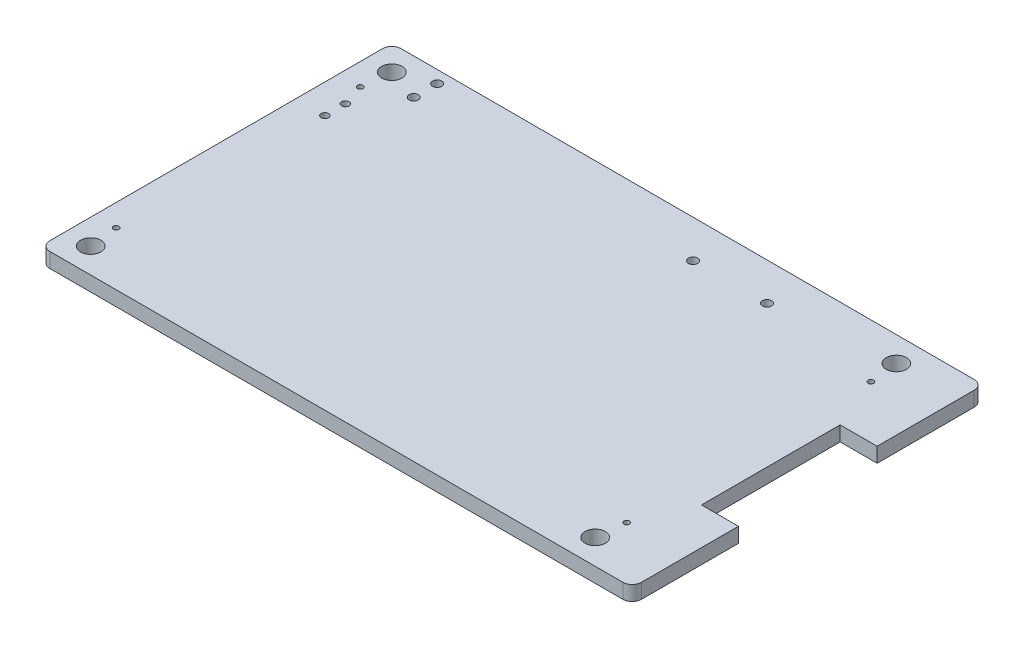
ISO-10303-21;
HEADER;
FILE_DESCRIPTION(('STEP AP214'),'2;1');
FILE_NAME('part.step','',(''),(''),'','','');
FILE_SCHEMA(('AUTOMOTIVE_DESIGN { 1 0 10303 214 1 1 1 1 }'));
ENDSEC;
DATA;
#1=APPLICATION_CONTEXT('core data for automotive mechanical design processes');
#2=APPLICATION_PROTOCOL_DEFINITION('international standard','automotive_design',2000,#1);
#3=PRODUCT_CONTEXT('',#1,'mechanical');
#4=PRODUCT('Part','Part','',(#3));
#5=PRODUCT_RELATED_PRODUCT_CATEGORY('part','',(#4));
#6=PRODUCT_DEFINITION_FORMATION('','',#4);
#7=PRODUCT_DEFINITION_CONTEXT('part definition',#1,'design');
#8=PRODUCT_DEFINITION('design','',#6,#7);
#9=PRODUCT_DEFINITION_SHAPE('','',#8);
#10=(LENGTH_UNIT() NAMED_UNIT(*) SI_UNIT(.MILLI.,.METRE.));
#11=(NAMED_UNIT(*) PLANE_ANGLE_UNIT() SI_UNIT($,.RADIAN.));
#12=(NAMED_UNIT(*) SI_UNIT($,.STERADIAN.) SOLID_ANGLE_UNIT());
#13=UNCERTAINTY_MEASURE_WITH_UNIT(LENGTH_MEASURE(1.E-05),#10,'distance_accuracy_value','');
#14=(GEOMETRIC_REPRESENTATION_CONTEXT(3) GLOBAL_UNCERTAINTY_ASSIGNED_CONTEXT((#13)) GLOBAL_UNIT_ASSIGNED_CONTEXT((#10,
#11,#12)) REPRESENTATION_CONTEXT('',''));
#15=CARTESIAN_POINT('',(0.,0.,0.));
#16=DIRECTION('',(0.,0.,1.));
#17=DIRECTION('',(1.,0.,0.));
#18=AXIS2_PLACEMENT_3D('',#15,#16,#17);
#19=CARTESIAN_POINT('',(34.,-1.6,7.5));
#20=DIRECTION('',(0.,0.,-1.));
#21=DIRECTION('',(-1.,0.,0.));
#22=AXIS2_PLACEMENT_3D('',#19,#20,#21);
#23=PLANE('',#22);
#24=DIRECTION('',(-1.,0.,0.));
#25=VECTOR('',#24,1.);
#26=CARTESIAN_POINT('',(34.,0.,7.5));
#27=LINE('',#26,#25);
#28=CARTESIAN_POINT('',(34.,0.,7.5));
#29=VERTEX_POINT('',#28);
#30=CARTESIAN_POINT('',(30.,0.,7.5));
#31=VERTEX_POINT('',#30);
#32=EDGE_CURVE('E166',#29,#31,#27,.T.);
#33=ORIENTED_EDGE('',*,*,#32,.F.);
#34=DIRECTION('',(0.,1.,0.));
#35=VECTOR('',#34,1.);
#36=CARTESIAN_POINT('',(34.,-1.6,7.5));
#37=LINE('',#36,#35);
#38=CARTESIAN_POINT('',(34.,-1.6,7.5));
#39=VERTEX_POINT('',#38);
#40=EDGE_CURVE('E11',#39,#29,#37,.T.);
#41=ORIENTED_EDGE('',*,*,#40,.F.);
#42=DIRECTION('',(-1.,0.,0.));
#43=VECTOR('',#42,1.);
#44=CARTESIAN_POINT('',(34.,-1.6,7.5));
#45=LINE('',#44,#43);
#46=CARTESIAN_POINT('',(30.,-1.6,7.5));
#47=VERTEX_POINT('',#46);
#48=EDGE_CURVE('E211',#39,#47,#45,.T.);
#49=ORIENTED_EDGE('',*,*,#48,.T.);
#50=DIRECTION('',(0.,1.,0.));
#51=VECTOR('',#50,1.);
#52=CARTESIAN_POINT('',(30.,-1.6,7.5));
#53=LINE('',#52,#51);
#54=EDGE_CURVE('E42',#47,#31,#53,.T.);
#55=ORIENTED_EDGE('',*,*,#54,.T.);
#56=EDGE_LOOP('',(#33,#41,#49,#55));
#57=FACE_BOUND('',#56,.T.);
#58=ADVANCED_FACE('F39',(#57),#23,.T.);
#59=CARTESIAN_POINT('',(34.,-1.6,18.));
#60=DIRECTION('',(1.,0.,0.));
#61=DIRECTION('',(0.,0.,-1.));
#62=AXIS2_PLACEMENT_3D('',#59,#60,#61);
#63=PLANE('',#62);
#64=DIRECTION('',(0.,0.,-1.));
#65=VECTOR('',#64,1.);
#66=CARTESIAN_POINT('',(34.,0.,18.));
#67=LINE('',#66,#65);
#68=CARTESIAN_POINT('',(34.,0.,18.));
#69=VERTEX_POINT('',#68);
#70=EDGE_CURVE('E208',#69,#29,#67,.T.);
#71=ORIENTED_EDGE('',*,*,#70,.F.);
#72=DIRECTION('',(0.,1.,0.));
#73=VECTOR('',#72,1.);
#74=CARTESIAN_POINT('',(34.,-1.6,18.));
#75=LINE('',#74,#73);
#76=CARTESIAN_POINT('',(34.,-1.6,18.));
#77=VERTEX_POINT('',#76);
#78=EDGE_CURVE('E49',#77,#69,#75,.T.);
#79=ORIENTED_EDGE('',*,*,#78,.F.);
#80=DIRECTION('',(0.,0.,-1.));
#81=VECTOR('',#80,1.);
#82=CARTESIAN_POINT('',(34.,-1.6,18.));
#83=LINE('',#82,#81);
#84=EDGE_CURVE('E152',#77,#39,#83,.T.);
#85=ORIENTED_EDGE('',*,*,#84,.T.);
#86=ORIENTED_EDGE('',*,*,#40,.T.);
#87=EDGE_LOOP('',(#71,#79,#85,#86));
#88=FACE_BOUND('',#87,.T.);
#89=ADVANCED_FACE('F241',(#88),#63,.T.);
#90=CARTESIAN_POINT('',(33.,-1.6,18.));
#91=DIRECTION('',(0.,1.,0.));
#92=DIRECTION('',(0.,0.,1.));
#93=AXIS2_PLACEMENT_3D('',#90,#91,#92);
#94=CYLINDRICAL_SURFACE('',#93,1.);
#95=CARTESIAN_POINT('',(33.,0.,18.));
#96=DIRECTION('',(0.,1.,0.));
#97=DIRECTION('',(0.,0.,1.));
#98=AXIS2_PLACEMENT_3D('',#95,#96,#97);
#99=CIRCLE('',#98,1.);
#100=CARTESIAN_POINT('',(33.,0.,19.));
#101=VERTEX_POINT('',#100);
#102=EDGE_CURVE('E138',#101,#69,#99,.T.);
#103=ORIENTED_EDGE('',*,*,#102,.F.);
#104=DIRECTION('',(0.,1.,0.));
#105=VECTOR('',#104,1.);
#106=CARTESIAN_POINT('',(33.,-1.6,19.));
#107=LINE('',#106,#105);
#108=CARTESIAN_POINT('',(33.,-1.6,19.));
#109=VERTEX_POINT('',#108);
#110=EDGE_CURVE('E133',#109,#101,#107,.T.);
#111=ORIENTED_EDGE('',*,*,#110,.F.);
#112=CARTESIAN_POINT('',(33.,-1.6,18.));
#113=DIRECTION('',(0.,1.,0.));
#114=DIRECTION('',(0.,0.,1.));
#115=AXIS2_PLACEMENT_3D('',#112,#113,#114);
#116=CIRCLE('',#115,1.);
#117=EDGE_CURVE('E136',#109,#77,#116,.T.);
#118=ORIENTED_EDGE('',*,*,#117,.T.);
#119=ORIENTED_EDGE('',*,*,#78,.T.);
#120=EDGE_LOOP('',(#103,#111,#118,#119));
#121=FACE_BOUND('',#120,.T.);
#122=ADVANCED_FACE('F135',(#121),#94,.T.);
#123=CARTESIAN_POINT('',(-29.,-1.6,19.));
#124=DIRECTION('',(0.,0.,1.));
#125=DIRECTION('',(1.,0.,0.));
#126=AXIS2_PLACEMENT_3D('',#123,#124,#125);
#127=PLANE('',#126);
#128=DIRECTION('',(1.,0.,0.));
#129=VECTOR('',#128,1.);
#130=CARTESIAN_POINT('',(-29.,0.,19.));
#131=LINE('',#130,#129);
#132=CARTESIAN_POINT('',(-29.,0.,19.));
#133=VERTEX_POINT('',#132);
#134=EDGE_CURVE('E203',#133,#101,#131,.T.);
#135=ORIENTED_EDGE('',*,*,#134,.F.);
#136=DIRECTION('',(0.,1.,0.));
#137=VECTOR('',#136,1.);
#138=CARTESIAN_POINT('',(-29.,-1.6,19.));
#139=LINE('',#138,#137);
#140=CARTESIAN_POINT('',(-29.,-1.6,19.));
#141=VERTEX_POINT('',#140);
#142=EDGE_CURVE('E144',#141,#133,#139,.T.);
#143=ORIENTED_EDGE('',*,*,#142,.F.);
#144=DIRECTION('',(1.,0.,0.));
#145=VECTOR('',#144,1.);
#146=CARTESIAN_POINT('',(-29.,-1.6,19.));
#147=LINE('',#146,#145);
#148=EDGE_CURVE('E150',#141,#109,#147,.T.);
#149=ORIENTED_EDGE('',*,*,#148,.T.);
#150=ORIENTED_EDGE('',*,*,#110,.T.);
#151=EDGE_LOOP('',(#135,#143,#149,#150));
#152=FACE_BOUND('',#151,.T.);
#153=ADVANCED_FACE('F155',(#152),#127,.T.);
#154=CARTESIAN_POINT('',(-29.,-1.6,18.));
#155=DIRECTION('',(0.,1.,0.));
#156=DIRECTION('',(0.,0.,1.));
#157=AXIS2_PLACEMENT_3D('',#154,#155,#156);
#158=CYLINDRICAL_SURFACE('',#157,1.);
#159=CARTESIAN_POINT('',(-29.,0.,18.));
#160=DIRECTION('',(0.,1.,0.));
#161=DIRECTION('',(0.,0.,1.));
#162=AXIS2_PLACEMENT_3D('',#159,#160,#161);
#163=CIRCLE('',#162,1.);
#164=CARTESIAN_POINT('',(-30.,0.,18.));
#165=VERTEX_POINT('',#164);
#166=EDGE_CURVE('E199',#165,#133,#163,.T.);
#167=ORIENTED_EDGE('',*,*,#166,.F.);
#168=DIRECTION('',(0.,1.,0.));
#169=VECTOR('',#168,1.);
#170=CARTESIAN_POINT('',(-30.,-1.6,18.));
#171=LINE('',#170,#169);
#172=CARTESIAN_POINT('',(-30.,-1.6,18.));
#173=VERTEX_POINT('',#172);
#174=EDGE_CURVE('E217',#173,#165,#171,.T.);
#175=ORIENTED_EDGE('',*,*,#174,.F.);
#176=CARTESIAN_POINT('',(-29.,-1.6,18.));
#177=DIRECTION('',(0.,1.,0.));
#178=DIRECTION('',(0.,0.,1.));
#179=AXIS2_PLACEMENT_3D('',#176,#177,#178);
#180=CIRCLE('',#179,1.);
#181=EDGE_CURVE('E157',#173,#141,#180,.T.);
#182=ORIENTED_EDGE('',*,*,#181,.T.);
#183=ORIENTED_EDGE('',*,*,#142,.T.);
#184=EDGE_LOOP('',(#167,#175,#182,#183));
#185=FACE_BOUND('',#184,.T.);
#186=ADVANCED_FACE('F254',(#185),#158,.T.);
#187=CARTESIAN_POINT('',(-30.,-1.6,-18.));
#188=DIRECTION('',(-1.,0.,0.));
#189=DIRECTION('',(0.,0.,1.));
#190=AXIS2_PLACEMENT_3D('',#187,#188,#189);
#191=PLANE('',#190);
#192=DIRECTION('',(0.,0.,1.));
#193=VECTOR('',#192,1.);
#194=CARTESIAN_POINT('',(-30.,0.,-18.));
#195=LINE('',#194,#193);
#196=CARTESIAN_POINT('',(-30.,0.,-18.));
#197=VERTEX_POINT('',#196);
#198=EDGE_CURVE('E195',#197,#165,#195,.T.);
#199=ORIENTED_EDGE('',*,*,#198,.F.);
#200=DIRECTION('',(0.,1.,0.));
#201=VECTOR('',#200,1.);
#202=CARTESIAN_POINT('',(-30.,-1.6,-18.));
#203=LINE('',#202,#201);
#204=CARTESIAN_POINT('',(-30.,-1.6,-18.));
#205=VERTEX_POINT('',#204);
#206=EDGE_CURVE('E220',#205,#197,#203,.T.);
#207=ORIENTED_EDGE('',*,*,#206,.F.);
#208=DIRECTION('',(0.,0.,1.));
#209=VECTOR('',#208,1.);
#210=CARTESIAN_POINT('',(-30.,-1.6,-18.));
#211=LINE('',#210,#209);
#212=EDGE_CURVE('E160',#205,#173,#211,.T.);
#213=ORIENTED_EDGE('',*,*,#212,.T.);
#214=ORIENTED_EDGE('',*,*,#174,.T.);
#215=EDGE_LOOP('',(#199,#207,#213,#214));
#216=FACE_BOUND('',#215,.T.);
#217=ADVANCED_FACE('F257',(#216),#191,.T.);
#218=CARTESIAN_POINT('',(-29.,-1.6,-18.));
#219=DIRECTION('',(0.,1.,0.));
#220=DIRECTION('',(0.,0.,1.));
#221=AXIS2_PLACEMENT_3D('',#218,#219,#220);
#222=CYLINDRICAL_SURFACE('',#221,1.);
#223=CARTESIAN_POINT('',(-29.,0.,-18.));
#224=DIRECTION('',(0.,1.,0.));
#225=DIRECTION('',(0.,0.,1.));
#226=AXIS2_PLACEMENT_3D('',#223,#224,#225);
#227=CIRCLE('',#226,1.);
#228=CARTESIAN_POINT('',(-29.,0.,-19.));
#229=VERTEX_POINT('',#228);
#230=EDGE_CURVE('E191',#229,#197,#227,.T.);
#231=ORIENTED_EDGE('',*,*,#230,.F.);
#232=DIRECTION('',(0.,1.,0.));
#233=VECTOR('',#232,1.);
#234=CARTESIAN_POINT('',(-29.,-1.6,-19.));
#235=LINE('',#234,#233);
#236=CARTESIAN_POINT('',(-29.,-1.6,-19.));
#237=VERTEX_POINT('',#236);
#238=EDGE_CURVE('E223',#237,#229,#235,.T.);
#239=ORIENTED_EDGE('',*,*,#238,.F.);
#240=CARTESIAN_POINT('',(-29.,-1.6,-18.));
#241=DIRECTION('',(0.,1.,0.));
#242=DIRECTION('',(0.,0.,1.));
#243=AXIS2_PLACEMENT_3D('',#240,#241,#242);
#244=CIRCLE('',#243,1.);
#245=EDGE_CURVE('E485',#237,#205,#244,.T.);
#246=ORIENTED_EDGE('',*,*,#245,.T.);
#247=ORIENTED_EDGE('',*,*,#206,.T.);
#248=EDGE_LOOP('',(#231,#239,#246,#247));
#249=FACE_BOUND('',#248,.T.);
#250=ADVANCED_FACE('F261',(#249),#222,.T.);
#251=CARTESIAN_POINT('',(33.,-1.6,-19.));
#252=DIRECTION('',(0.,0.,-1.));
#253=DIRECTION('',(-1.,0.,0.));
#254=AXIS2_PLACEMENT_3D('',#251,#252,#253);
#255=PLANE('',#254);
#256=DIRECTION('',(-1.,0.,0.));
#257=VECTOR('',#256,1.);
#258=CARTESIAN_POINT('',(33.,0.,-19.));
#259=LINE('',#258,#257);
#260=CARTESIAN_POINT('',(33.,0.,-19.));
#261=VERTEX_POINT('',#260);
#262=EDGE_CURVE('E187',#261,#229,#259,.T.);
#263=ORIENTED_EDGE('',*,*,#262,.F.);
#264=DIRECTION('',(0.,1.,0.));
#265=VECTOR('',#264,1.);
#266=CARTESIAN_POINT('',(33.,-1.6,-19.));
#267=LINE('',#266,#265);
#268=CARTESIAN_POINT('',(33.,-1.6,-19.));
#269=VERTEX_POINT('',#268);
#270=EDGE_CURVE('E226',#269,#261,#267,.T.);
#271=ORIENTED_EDGE('',*,*,#270,.F.);
#272=DIRECTION('',(-1.,0.,0.));
#273=VECTOR('',#272,1.);
#274=CARTESIAN_POINT('',(33.,-1.6,-19.));
#275=LINE('',#274,#273);
#276=EDGE_CURVE('E481',#269,#237,#275,.T.);
#277=ORIENTED_EDGE('',*,*,#276,.T.);
#278=ORIENTED_EDGE('',*,*,#238,.T.);
#279=EDGE_LOOP('',(#263,#271,#277,#278));
#280=FACE_BOUND('',#279,.T.);
#281=ADVANCED_FACE('F265',(#280),#255,.T.);
#282=CARTESIAN_POINT('',(33.,-1.6,-18.));
#283=DIRECTION('',(0.,1.,0.));
#284=DIRECTION('',(0.,0.,1.));
#285=AXIS2_PLACEMENT_3D('',#282,#283,#284);
#286=CYLINDRICAL_SURFACE('',#285,1.);
#287=CARTESIAN_POINT('',(33.,0.,-18.));
#288=DIRECTION('',(0.,1.,0.));
#289=DIRECTION('',(0.,0.,1.));
#290=AXIS2_PLACEMENT_3D('',#287,#288,#289);
#291=CIRCLE('',#290,1.);
#292=CARTESIAN_POINT('',(34.,0.,-18.));
#293=VERTEX_POINT('',#292);
#294=EDGE_CURVE('E183',#293,#261,#291,.T.);
#295=ORIENTED_EDGE('',*,*,#294,.F.);
#296=DIRECTION('',(0.,1.,0.));
#297=VECTOR('',#296,1.);
#298=CARTESIAN_POINT('',(34.,-1.6,-18.));
#299=LINE('',#298,#297);
#300=CARTESIAN_POINT('',(34.,-1.6,-18.));
#301=VERTEX_POINT('',#300);
#302=EDGE_CURVE('E229',#301,#293,#299,.T.);
#303=ORIENTED_EDGE('',*,*,#302,.F.);
#304=CARTESIAN_POINT('',(33.,-1.6,-18.));
#305=DIRECTION('',(0.,1.,0.));
#306=DIRECTION('',(0.,0.,1.));
#307=AXIS2_PLACEMENT_3D('',#304,#305,#306);
#308=CIRCLE('',#307,1.);
#309=EDGE_CURVE('E477',#301,#269,#308,.T.);
#310=ORIENTED_EDGE('',*,*,#309,.T.);
#311=ORIENTED_EDGE('',*,*,#270,.T.);
#312=EDGE_LOOP('',(#295,#303,#310,#311));
#313=FACE_BOUND('',#312,.T.);
#314=ADVANCED_FACE('F269',(#313),#286,.T.);
#315=CARTESIAN_POINT('',(34.,-1.6,-7.5));
#316=DIRECTION('',(1.,0.,0.));
#317=DIRECTION('',(0.,0.,-1.));
#318=AXIS2_PLACEMENT_3D('',#315,#316,#317);
#319=PLANE('',#318);
#320=DIRECTION('',(0.,0.,-1.));
#321=VECTOR('',#320,1.);
#322=CARTESIAN_POINT('',(34.,0.,-7.5));
#323=LINE('',#322,#321);
#324=CARTESIAN_POINT('',(34.,0.,-7.5));
#325=VERTEX_POINT('',#324);
#326=EDGE_CURVE('E179',#325,#293,#323,.T.);
#327=ORIENTED_EDGE('',*,*,#326,.F.);
#328=DIRECTION('',(0.,1.,0.));
#329=VECTOR('',#328,1.);
#330=CARTESIAN_POINT('',(34.,-1.6,-7.5));
#331=LINE('',#330,#329);
#332=CARTESIAN_POINT('',(34.,-1.6,-7.5));
#333=VERTEX_POINT('',#332);
#334=EDGE_CURVE('E232',#333,#325,#331,.T.);
#335=ORIENTED_EDGE('',*,*,#334,.F.);
#336=DIRECTION('',(0.,0.,-1.));
#337=VECTOR('',#336,1.);
#338=CARTESIAN_POINT('',(34.,-1.6,-7.5));
#339=LINE('',#338,#337);
#340=EDGE_CURVE('E473',#333,#301,#339,.T.);
#341=ORIENTED_EDGE('',*,*,#340,.T.);
#342=ORIENTED_EDGE('',*,*,#302,.T.);
#343=EDGE_LOOP('',(#327,#335,#341,#342));
#344=FACE_BOUND('',#343,.T.);
#345=ADVANCED_FACE('F273',(#344),#319,.T.);
#346=CARTESIAN_POINT('',(30.,-1.6,-7.5));
#347=DIRECTION('',(0.,0.,1.));
#348=DIRECTION('',(1.,0.,0.));
#349=AXIS2_PLACEMENT_3D('',#346,#347,#348);
#350=PLANE('',#349);
#351=DIRECTION('',(1.,0.,0.));
#352=VECTOR('',#351,1.);
#353=CARTESIAN_POINT('',(30.,0.,-7.5));
#354=LINE('',#353,#352);
#355=CARTESIAN_POINT('',(30.,0.,-7.5));
#356=VERTEX_POINT('',#355);
#357=EDGE_CURVE('E175',#356,#325,#354,.T.);
#358=ORIENTED_EDGE('',*,*,#357,.F.);
#359=DIRECTION('',(0.,1.,0.));
#360=VECTOR('',#359,1.);
#361=CARTESIAN_POINT('',(30.,-1.6,-7.5));
#362=LINE('',#361,#360);
#363=CARTESIAN_POINT('',(30.,-1.6,-7.5));
#364=VERTEX_POINT('',#363);
#365=EDGE_CURVE('E234',#364,#356,#362,.T.);
#366=ORIENTED_EDGE('',*,*,#365,.F.);
#367=DIRECTION('',(1.,0.,0.));
#368=VECTOR('',#367,1.);
#369=CARTESIAN_POINT('',(30.,-1.6,-7.5));
#370=LINE('',#369,#368);
#371=EDGE_CURVE('E469',#364,#333,#370,.T.);
#372=ORIENTED_EDGE('',*,*,#371,.T.);
#373=ORIENTED_EDGE('',*,*,#334,.T.);
#374=EDGE_LOOP('',(#358,#366,#372,#373));
#375=FACE_BOUND('',#374,.T.);
#376=ADVANCED_FACE('F277',(#375),#350,.T.);
#377=CARTESIAN_POINT('',(30.,-1.6,7.5));
#378=DIRECTION('',(1.,0.,0.));
#379=DIRECTION('',(0.,0.,-1.));
#380=AXIS2_PLACEMENT_3D('',#377,#378,#379);
#381=PLANE('',#380);
#382=DIRECTION('',(0.,0.,-1.));
#383=VECTOR('',#382,1.);
#384=CARTESIAN_POINT('',(30.,0.,7.5));
#385=LINE('',#384,#383);
#386=EDGE_CURVE('E170',#31,#356,#385,.T.);
#387=ORIENTED_EDGE('',*,*,#386,.F.);
#388=ORIENTED_EDGE('',*,*,#54,.F.);
#389=DIRECTION('',(0.,0.,-1.));
#390=VECTOR('',#389,1.);
#391=CARTESIAN_POINT('',(30.,-1.6,7.5));
#392=LINE('',#391,#390);
#393=EDGE_CURVE('E466',#47,#364,#392,.T.);
#394=ORIENTED_EDGE('',*,*,#393,.T.);
#395=ORIENTED_EDGE('',*,*,#365,.T.);
#396=EDGE_LOOP('',(#387,#388,#394,#395));
#397=FACE_BOUND('',#396,.T.);
#398=ADVANCED_FACE('F238',(#397),#381,.T.);
#399=CARTESIAN_POINT('',(33.,-1.6,-18.));
#400=DIRECTION('',(0.,1.,0.));
#401=DIRECTION('',(0.,0.,1.));
#402=AXIS2_PLACEMENT_3D('',#399,#400,#401);
#403=PLANE('',#402);
#404=CARTESIAN_POINT('',(-27.28999876,-1.6,-16.29000044));
#405=DIRECTION('',(0.,1.,0.));
#406=DIRECTION('',(0.,0.,-1.));
#407=AXIS2_PLACEMENT_3D('',#404,#405,#406);
#408=CIRCLE('',#407,1.1);
#409=CARTESIAN_POINT('',(-27.28999876,-1.6,-17.39000044));
#410=VERTEX_POINT('',#409);
#411=EDGE_CURVE('E352',#410,#410,#408,.T.);
#412=ORIENTED_EDGE('',*,*,#411,.T.);
#413=EDGE_LOOP('',(#412));
#414=FACE_BOUND('',#413,.T.);
#415=CARTESIAN_POINT('',(-27.62000064,-1.6,-13.1999990000001));
#416=DIRECTION('',(0.,1.,0.));
#417=DIRECTION('',(0.,0.,-1.));
#418=AXIS2_PLACEMENT_3D('',#415,#416,#417);
#419=CIRCLE('',#418,0.299999400000001);
#420=CARTESIAN_POINT('',(-27.62000064,-1.6,-13.4999984000001));
#421=VERTEX_POINT('',#420);
#422=EDGE_CURVE('E362',#421,#421,#419,.T.);
#423=ORIENTED_EDGE('',*,*,#422,.T.);
#424=EDGE_LOOP('',(#423));
#425=FACE_BOUND('',#424,.T.);
#426=CARTESIAN_POINT('',(-23.75582498,-1.6,-17.66569238));
#427=DIRECTION('',(0.,1.,0.));
#428=DIRECTION('',(0.,0.,-1.));
#429=AXIS2_PLACEMENT_3D('',#426,#427,#428);
#430=CIRCLE('',#429,0.499999000000001);
#431=CARTESIAN_POINT('',(-23.75582498,-1.6,-18.16569138));
#432=VERTEX_POINT('',#431);
#433=EDGE_CURVE('E370',#432,#432,#430,.T.);
#434=ORIENTED_EDGE('',*,*,#433,.T.);
#435=EDGE_LOOP('',(#434));
#436=FACE_BOUND('',#435,.T.);
#437=CARTESIAN_POINT('',(-26.84364202,-1.6,-10.8197142));
#438=DIRECTION('',(0.,1.,0.));
#439=DIRECTION('',(0.,0.,-1.));
#440=AXIS2_PLACEMENT_3D('',#437,#438,#439);
#441=CIRCLE('',#440,0.399999200000001);
#442=CARTESIAN_POINT('',(-26.84364202,-1.6,-11.2197134));
#443=VERTEX_POINT('',#442);
#444=EDGE_CURVE('E378',#443,#443,#441,.T.);
#445=ORIENTED_EDGE('',*,*,#444,.T.);
#446=EDGE_LOOP('',(#445));
#447=FACE_BOUND('',#446,.T.);
#448=CARTESIAN_POINT('',(-27.62000064,-1.6,13.1999989999999));
#449=DIRECTION('',(0.,1.,0.));
#450=DIRECTION('',(0.,0.,-1.));
#451=AXIS2_PLACEMENT_3D('',#448,#449,#450);
#452=CIRCLE('',#451,0.299999400000001);
#453=CARTESIAN_POINT('',(-27.62000064,-1.6,12.8999995999999));
#454=VERTEX_POINT('',#453);
#455=EDGE_CURVE('E386',#454,#454,#452,.T.);
#456=ORIENTED_EDGE('',*,*,#455,.T.);
#457=EDGE_LOOP('',(#456));
#458=FACE_BOUND('',#457,.T.);
#459=CARTESIAN_POINT('',(-27.28999876,-1.6,16.29000044));
#460=DIRECTION('',(0.,1.,0.));
#461=DIRECTION('',(0.,0.,-1.));
#462=AXIS2_PLACEMENT_3D('',#459,#460,#461);
#463=CIRCLE('',#462,1.1);
#464=CARTESIAN_POINT('',(-27.28999876,-1.6,15.19000044));
#465=VERTEX_POINT('',#464);
#466=EDGE_CURVE('E394',#465,#465,#463,.T.);
#467=ORIENTED_EDGE('',*,*,#466,.T.);
#468=EDGE_LOOP('',(#467));
#469=FACE_BOUND('',#468,.T.);
#470=CARTESIAN_POINT('',(-26.84364202,-1.6,-8.59971356000005));
#471=DIRECTION('',(0.,1.,0.));
#472=DIRECTION('',(0.,0.,-1.));
#473=AXIS2_PLACEMENT_3D('',#470,#471,#472);
#474=CIRCLE('',#473,0.399999200000001);
#475=CARTESIAN_POINT('',(-26.84364202,-1.6,-8.99971276000006));
#476=VERTEX_POINT('',#475);
#477=EDGE_CURVE('E402',#476,#476,#474,.T.);
#478=ORIENTED_EDGE('',*,*,#477,.T.);
#479=EDGE_LOOP('',(#478));
#480=FACE_BOUND('',#479,.T.);
#481=CARTESIAN_POINT('',(-23.75582498,-1.6,-15.12569238));
#482=DIRECTION('',(0.,1.,0.));
#483=DIRECTION('',(0.,0.,-1.));
#484=AXIS2_PLACEMENT_3D('',#481,#482,#483);
#485=CIRCLE('',#484,0.499999000000001);
#486=CARTESIAN_POINT('',(-23.75582498,-1.6,-15.62569138));
#487=VERTEX_POINT('',#486);
#488=EDGE_CURVE('E410',#487,#487,#485,.T.);
#489=ORIENTED_EDGE('',*,*,#488,.T.);
#490=EDGE_LOOP('',(#489));
#491=FACE_BOUND('',#490,.T.);
#492=CARTESIAN_POINT('',(6.66761430000003,-1.6,-14.9207728));
#493=DIRECTION('',(0.,1.,0.));
#494=DIRECTION('',(0.,0.,-1.));
#495=AXIS2_PLACEMENT_3D('',#492,#493,#494);
#496=CIRCLE('',#495,0.499999);
#497=CARTESIAN_POINT('',(6.66761430000003,-1.6,-15.4207718));
#498=VERTEX_POINT('',#497);
#499=EDGE_CURVE('E418',#498,#498,#496,.T.);
#500=ORIENTED_EDGE('',*,*,#499,.T.);
#501=EDGE_LOOP('',(#500));
#502=FACE_BOUND('',#501,.T.);
#503=CARTESIAN_POINT('',(27.28999876,-1.6,-16.29000044));
#504=DIRECTION('',(0.,1.,0.));
#505=DIRECTION('',(0.,0.,-1.));
#506=AXIS2_PLACEMENT_3D('',#503,#504,#505);
#507=CIRCLE('',#506,1.1);
#508=CARTESIAN_POINT('',(27.28999876,-1.6,-17.39000044));
#509=VERTEX_POINT('',#508);
#510=EDGE_CURVE('E426',#509,#509,#507,.T.);
#511=ORIENTED_EDGE('',*,*,#510,.T.);
#512=EDGE_LOOP('',(#511));
#513=FACE_BOUND('',#512,.T.);
#514=CARTESIAN_POINT('',(14.65628514,-1.6,-14.9244405600001));
#515=DIRECTION('',(0.,1.,0.));
#516=DIRECTION('',(0.,0.,-1.));
#517=AXIS2_PLACEMENT_3D('',#514,#515,#516);
#518=CIRCLE('',#517,0.499998999999999);
#519=CARTESIAN_POINT('',(14.65628514,-1.6,-15.42443956));
#520=VERTEX_POINT('',#519);
#521=EDGE_CURVE('E434',#520,#520,#518,.T.);
#522=ORIENTED_EDGE('',*,*,#521,.T.);
#523=EDGE_LOOP('',(#522));
#524=FACE_BOUND('',#523,.T.);
#525=CARTESIAN_POINT('',(27.62000064,-1.6,13.1999989999999));
#526=DIRECTION('',(0.,1.,0.));
#527=DIRECTION('',(0.,0.,-1.));
#528=AXIS2_PLACEMENT_3D('',#525,#526,#527);
#529=CIRCLE('',#528,0.299999400000001);
#530=CARTESIAN_POINT('',(27.62000064,-1.6,12.8999995999999));
#531=VERTEX_POINT('',#530);
#532=EDGE_CURVE('E442',#531,#531,#529,.T.);
#533=ORIENTED_EDGE('',*,*,#532,.T.);
#534=EDGE_LOOP('',(#533));
#535=FACE_BOUND('',#534,.T.);
#536=CARTESIAN_POINT('',(27.28999876,-1.6,16.29000044));
#537=DIRECTION('',(0.,1.,0.));
#538=DIRECTION('',(0.,0.,-1.));
#539=AXIS2_PLACEMENT_3D('',#536,#537,#538);
#540=CIRCLE('',#539,1.1);
#541=CARTESIAN_POINT('',(27.28999876,-1.6,15.19000044));
#542=VERTEX_POINT('',#541);
#543=EDGE_CURVE('E450',#542,#542,#540,.T.);
#544=ORIENTED_EDGE('',*,*,#543,.T.);
#545=EDGE_LOOP('',(#544));
#546=FACE_BOUND('',#545,.T.);
#547=CARTESIAN_POINT('',(27.62000064,-1.6,-13.1999990000001));
#548=DIRECTION('',(0.,1.,0.));
#549=DIRECTION('',(0.,0.,-1.));
#550=AXIS2_PLACEMENT_3D('',#547,#548,#549);
#551=CIRCLE('',#550,0.299999400000001);
#552=CARTESIAN_POINT('',(27.62000064,-1.6,-13.4999984000001));
#553=VERTEX_POINT('',#552);
#554=EDGE_CURVE('E171',#553,#553,#551,.T.);
#555=ORIENTED_EDGE('',*,*,#554,.T.);
#556=EDGE_LOOP('',(#555));
#557=FACE_BOUND('',#556,.T.);
#558=ORIENTED_EDGE('',*,*,#48,.F.);
#559=ORIENTED_EDGE('',*,*,#84,.F.);
#560=ORIENTED_EDGE('',*,*,#117,.F.);
#561=ORIENTED_EDGE('',*,*,#148,.F.);
#562=ORIENTED_EDGE('',*,*,#181,.F.);
#563=ORIENTED_EDGE('',*,*,#212,.F.);
#564=ORIENTED_EDGE('',*,*,#245,.F.);
#565=ORIENTED_EDGE('',*,*,#276,.F.);
#566=ORIENTED_EDGE('',*,*,#309,.F.);
#567=ORIENTED_EDGE('',*,*,#340,.F.);
#568=ORIENTED_EDGE('',*,*,#371,.F.);
#569=ORIENTED_EDGE('',*,*,#393,.F.);
#570=EDGE_LOOP('',(#558,#559,#560,#561,#562,#563,#564,#565,#566,#567,#568,#569));
#571=FACE_BOUND('',#570,.T.);
#572=ADVANCED_FACE('F148',(#414,#425,#436,#447,#458,#469,#480,#491,#502,#513,#524,#535,#546,
#557,#571),#403,.F.);
#573=CARTESIAN_POINT('',(33.,0.,-18.));
#574=DIRECTION('',(0.,1.,0.));
#575=DIRECTION('',(0.,0.,1.));
#576=AXIS2_PLACEMENT_3D('',#573,#574,#575);
#577=PLANE('',#576);
#578=CARTESIAN_POINT('',(-27.28999876,0.,-16.29000044));
#579=DIRECTION('',(0.,1.,0.));
#580=DIRECTION('',(0.,0.,-1.));
#581=AXIS2_PLACEMENT_3D('',#578,#579,#580);
#582=CIRCLE('',#581,1.1);
#583=CARTESIAN_POINT('',(-27.28999876,0.,-17.39000044));
#584=VERTEX_POINT('',#583);
#585=EDGE_CURVE('E355',#584,#584,#582,.T.);
#586=ORIENTED_EDGE('',*,*,#585,.F.);
#587=EDGE_LOOP('',(#586));
#588=FACE_BOUND('',#587,.T.);
#589=CARTESIAN_POINT('',(-27.62000064,0.,-13.1999990000001));
#590=DIRECTION('',(0.,1.,0.));
#591=DIRECTION('',(0.,0.,-1.));
#592=AXIS2_PLACEMENT_3D('',#589,#590,#591);
#593=CIRCLE('',#592,0.299999400000001);
#594=CARTESIAN_POINT('',(-27.62000064,0.,-13.4999984000001));
#595=VERTEX_POINT('',#594);
#596=EDGE_CURVE('E359',#595,#595,#593,.T.);
#597=ORIENTED_EDGE('',*,*,#596,.F.);
#598=EDGE_LOOP('',(#597));
#599=FACE_BOUND('',#598,.T.);
#600=CARTESIAN_POINT('',(-23.75582498,0.,-17.66569238));
#601=DIRECTION('',(0.,1.,0.));
#602=DIRECTION('',(0.,0.,-1.));
#603=AXIS2_PLACEMENT_3D('',#600,#601,#602);
#604=CIRCLE('',#603,0.499999000000001);
#605=CARTESIAN_POINT('',(-23.75582498,0.,-18.16569138));
#606=VERTEX_POINT('',#605);
#607=EDGE_CURVE('E366',#606,#606,#604,.T.);
#608=ORIENTED_EDGE('',*,*,#607,.F.);
#609=EDGE_LOOP('',(#608));
#610=FACE_BOUND('',#609,.T.);
#611=CARTESIAN_POINT('',(-26.84364202,0.,-10.8197142));
#612=DIRECTION('',(0.,1.,0.));
#613=DIRECTION('',(0.,0.,-1.));
#614=AXIS2_PLACEMENT_3D('',#611,#612,#613);
#615=CIRCLE('',#614,0.399999200000001);
#616=CARTESIAN_POINT('',(-26.84364202,0.,-11.2197134));
#617=VERTEX_POINT('',#616);
#618=EDGE_CURVE('E374',#617,#617,#615,.T.);
#619=ORIENTED_EDGE('',*,*,#618,.F.);
#620=EDGE_LOOP('',(#619));
#621=FACE_BOUND('',#620,.T.);
#622=CARTESIAN_POINT('',(-27.62000064,0.,13.1999989999999));
#623=DIRECTION('',(0.,1.,0.));
#624=DIRECTION('',(0.,0.,-1.));
#625=AXIS2_PLACEMENT_3D('',#622,#623,#624);
#626=CIRCLE('',#625,0.299999400000001);
#627=CARTESIAN_POINT('',(-27.62000064,0.,12.8999995999999));
#628=VERTEX_POINT('',#627);
#629=EDGE_CURVE('E382',#628,#628,#626,.T.);
#630=ORIENTED_EDGE('',*,*,#629,.F.);
#631=EDGE_LOOP('',(#630));
#632=FACE_BOUND('',#631,.T.);
#633=CARTESIAN_POINT('',(-27.28999876,0.,16.29000044));
#634=DIRECTION('',(0.,1.,0.));
#635=DIRECTION('',(0.,0.,-1.));
#636=AXIS2_PLACEMENT_3D('',#633,#634,#635);
#637=CIRCLE('',#636,1.1);
#638=CARTESIAN_POINT('',(-27.28999876,0.,15.19000044));
#639=VERTEX_POINT('',#638);
#640=EDGE_CURVE('E390',#639,#639,#637,.T.);
#641=ORIENTED_EDGE('',*,*,#640,.F.);
#642=EDGE_LOOP('',(#641));
#643=FACE_BOUND('',#642,.T.);
#644=CARTESIAN_POINT('',(-26.84364202,0.,-8.59971356000005));
#645=DIRECTION('',(0.,1.,0.));
#646=DIRECTION('',(0.,0.,-1.));
#647=AXIS2_PLACEMENT_3D('',#644,#645,#646);
#648=CIRCLE('',#647,0.399999200000001);
#649=CARTESIAN_POINT('',(-26.84364202,0.,-8.99971276000006));
#650=VERTEX_POINT('',#649);
#651=EDGE_CURVE('E398',#650,#650,#648,.T.);
#652=ORIENTED_EDGE('',*,*,#651,.F.);
#653=EDGE_LOOP('',(#652));
#654=FACE_BOUND('',#653,.T.);
#655=CARTESIAN_POINT('',(-23.75582498,0.,-15.12569238));
#656=DIRECTION('',(0.,1.,0.));
#657=DIRECTION('',(0.,0.,-1.));
#658=AXIS2_PLACEMENT_3D('',#655,#656,#657);
#659=CIRCLE('',#658,0.499999000000001);
#660=CARTESIAN_POINT('',(-23.75582498,0.,-15.62569138));
#661=VERTEX_POINT('',#660);
#662=EDGE_CURVE('E406',#661,#661,#659,.T.);
#663=ORIENTED_EDGE('',*,*,#662,.F.);
#664=EDGE_LOOP('',(#663));
#665=FACE_BOUND('',#664,.T.);
#666=CARTESIAN_POINT('',(6.66761430000003,0.,-14.9207728));
#667=DIRECTION('',(0.,1.,0.));
#668=DIRECTION('',(0.,0.,-1.));
#669=AXIS2_PLACEMENT_3D('',#666,#667,#668);
#670=CIRCLE('',#669,0.499999);
#671=CARTESIAN_POINT('',(6.66761430000003,0.,-15.4207718));
#672=VERTEX_POINT('',#671);
#673=EDGE_CURVE('E414',#672,#672,#670,.T.);
#674=ORIENTED_EDGE('',*,*,#673,.F.);
#675=EDGE_LOOP('',(#674));
#676=FACE_BOUND('',#675,.T.);
#677=CARTESIAN_POINT('',(27.28999876,0.,-16.29000044));
#678=DIRECTION('',(0.,1.,0.));
#679=DIRECTION('',(0.,0.,-1.));
#680=AXIS2_PLACEMENT_3D('',#677,#678,#679);
#681=CIRCLE('',#680,1.1);
#682=CARTESIAN_POINT('',(27.28999876,0.,-17.39000044));
#683=VERTEX_POINT('',#682);
#684=EDGE_CURVE('E422',#683,#683,#681,.T.);
#685=ORIENTED_EDGE('',*,*,#684,.F.);
#686=EDGE_LOOP('',(#685));
#687=FACE_BOUND('',#686,.T.);
#688=CARTESIAN_POINT('',(14.65628514,0.,-14.9244405600001));
#689=DIRECTION('',(0.,1.,0.));
#690=DIRECTION('',(0.,0.,-1.));
#691=AXIS2_PLACEMENT_3D('',#688,#689,#690);
#692=CIRCLE('',#691,0.499998999999999);
#693=CARTESIAN_POINT('',(14.65628514,0.,-15.42443956));
#694=VERTEX_POINT('',#693);
#695=EDGE_CURVE('E430',#694,#694,#692,.T.);
#696=ORIENTED_EDGE('',*,*,#695,.F.);
#697=EDGE_LOOP('',(#696));
#698=FACE_BOUND('',#697,.T.);
#699=CARTESIAN_POINT('',(27.62000064,0.,13.1999989999999));
#700=DIRECTION('',(0.,1.,0.));
#701=DIRECTION('',(0.,0.,-1.));
#702=AXIS2_PLACEMENT_3D('',#699,#700,#701);
#703=CIRCLE('',#702,0.299999400000001);
#704=CARTESIAN_POINT('',(27.62000064,0.,12.8999995999999));
#705=VERTEX_POINT('',#704);
#706=EDGE_CURVE('E438',#705,#705,#703,.T.);
#707=ORIENTED_EDGE('',*,*,#706,.F.);
#708=EDGE_LOOP('',(#707));
#709=FACE_BOUND('',#708,.T.);
#710=CARTESIAN_POINT('',(27.28999876,0.,16.29000044));
#711=DIRECTION('',(0.,1.,0.));
#712=DIRECTION('',(0.,0.,-1.));
#713=AXIS2_PLACEMENT_3D('',#710,#711,#712);
#714=CIRCLE('',#713,1.1);
#715=CARTESIAN_POINT('',(27.28999876,0.,15.19000044));
#716=VERTEX_POINT('',#715);
#717=EDGE_CURVE('E446',#716,#716,#714,.T.);
#718=ORIENTED_EDGE('',*,*,#717,.F.);
#719=EDGE_LOOP('',(#718));
#720=FACE_BOUND('',#719,.T.);
#721=CARTESIAN_POINT('',(27.62000064,0.,-13.1999990000001));
#722=DIRECTION('',(0.,1.,0.));
#723=DIRECTION('',(0.,0.,-1.));
#724=AXIS2_PLACEMENT_3D('',#721,#722,#723);
#725=CIRCLE('',#724,0.299999400000001);
#726=CARTESIAN_POINT('',(27.62000064,0.,-13.4999984000001));
#727=VERTEX_POINT('',#726);
#728=EDGE_CURVE('E454',#727,#727,#725,.T.);
#729=ORIENTED_EDGE('',*,*,#728,.F.);
#730=EDGE_LOOP('',(#729));
#731=FACE_BOUND('',#730,.T.);
#732=ORIENTED_EDGE('',*,*,#32,.T.);
#733=ORIENTED_EDGE('',*,*,#386,.T.);
#734=ORIENTED_EDGE('',*,*,#357,.T.);
#735=ORIENTED_EDGE('',*,*,#326,.T.);
#736=ORIENTED_EDGE('',*,*,#294,.T.);
#737=ORIENTED_EDGE('',*,*,#262,.T.);
#738=ORIENTED_EDGE('',*,*,#230,.T.);
#739=ORIENTED_EDGE('',*,*,#198,.T.);
#740=ORIENTED_EDGE('',*,*,#166,.T.);
#741=ORIENTED_EDGE('',*,*,#134,.T.);
#742=ORIENTED_EDGE('',*,*,#102,.T.);
#743=ORIENTED_EDGE('',*,*,#70,.T.);
#744=EDGE_LOOP('',(#732,#733,#734,#735,#736,#737,#738,#739,#740,#741,#742,#743));
#745=FACE_BOUND('',#744,.T.);
#746=ADVANCED_FACE('F240',(#588,#599,#610,#621,#632,#643,#654,#665,#676,#687,#698,#709,#720,
#731,#745),#577,.T.);
#747=CARTESIAN_POINT('',(27.62000064,-1.6,-13.1999990000001));
#748=DIRECTION('',(0.,1.,0.));
#749=DIRECTION('',(0.,0.,1.));
#750=AXIS2_PLACEMENT_3D('',#747,#748,#749);
#751=CYLINDRICAL_SURFACE('',#750,0.299999400000001);
#752=ORIENTED_EDGE('',*,*,#554,.F.);
#753=EDGE_LOOP('',(#752));
#754=FACE_BOUND('',#753,.T.);
#755=ORIENTED_EDGE('',*,*,#728,.T.);
#756=EDGE_LOOP('',(#755));
#757=FACE_BOUND('',#756,.T.);
#758=ADVANCED_FACE('F289',(#754,#757),#751,.F.);
#759=CARTESIAN_POINT('',(27.28999876,-1.6,16.29000044));
#760=DIRECTION('',(0.,1.,0.));
#761=DIRECTION('',(0.,0.,1.));
#762=AXIS2_PLACEMENT_3D('',#759,#760,#761);
#763=CYLINDRICAL_SURFACE('',#762,1.1);
#764=ORIENTED_EDGE('',*,*,#543,.F.);
#765=EDGE_LOOP('',(#764));
#766=FACE_BOUND('',#765,.T.);
#767=ORIENTED_EDGE('',*,*,#717,.T.);
#768=EDGE_LOOP('',(#767));
#769=FACE_BOUND('',#768,.T.);
#770=ADVANCED_FACE('F296',(#766,#769),#763,.F.);
#771=CARTESIAN_POINT('',(27.62000064,-1.6,13.1999989999999));
#772=DIRECTION('',(0.,1.,0.));
#773=DIRECTION('',(0.,0.,1.));
#774=AXIS2_PLACEMENT_3D('',#771,#772,#773);
#775=CYLINDRICAL_SURFACE('',#774,0.299999400000001);
#776=ORIENTED_EDGE('',*,*,#532,.F.);
#777=EDGE_LOOP('',(#776));
#778=FACE_BOUND('',#777,.T.);
#779=ORIENTED_EDGE('',*,*,#706,.T.);
#780=EDGE_LOOP('',(#779));
#781=FACE_BOUND('',#780,.T.);
#782=ADVANCED_FACE('F300',(#778,#781),#775,.F.);
#783=CARTESIAN_POINT('',(14.65628514,-1.6,-14.9244405600001));
#784=DIRECTION('',(0.,1.,0.));
#785=DIRECTION('',(0.,0.,1.));
#786=AXIS2_PLACEMENT_3D('',#783,#784,#785);
#787=CYLINDRICAL_SURFACE('',#786,0.499998999999999);
#788=ORIENTED_EDGE('',*,*,#521,.F.);
#789=EDGE_LOOP('',(#788));
#790=FACE_BOUND('',#789,.T.);
#791=ORIENTED_EDGE('',*,*,#695,.T.);
#792=EDGE_LOOP('',(#791));
#793=FACE_BOUND('',#792,.T.);
#794=ADVANCED_FACE('F304',(#790,#793),#787,.F.);
#795=CARTESIAN_POINT('',(27.28999876,-1.6,-16.29000044));
#796=DIRECTION('',(0.,1.,0.));
#797=DIRECTION('',(0.,0.,1.));
#798=AXIS2_PLACEMENT_3D('',#795,#796,#797);
#799=CYLINDRICAL_SURFACE('',#798,1.1);
#800=ORIENTED_EDGE('',*,*,#510,.F.);
#801=EDGE_LOOP('',(#800));
#802=FACE_BOUND('',#801,.T.);
#803=ORIENTED_EDGE('',*,*,#684,.T.);
#804=EDGE_LOOP('',(#803));
#805=FACE_BOUND('',#804,.T.);
#806=ADVANCED_FACE('F308',(#802,#805),#799,.F.);
#807=CARTESIAN_POINT('',(6.66761430000003,-1.6,-14.9207728));
#808=DIRECTION('',(0.,1.,0.));
#809=DIRECTION('',(0.,0.,1.));
#810=AXIS2_PLACEMENT_3D('',#807,#808,#809);
#811=CYLINDRICAL_SURFACE('',#810,0.499999);
#812=ORIENTED_EDGE('',*,*,#499,.F.);
#813=EDGE_LOOP('',(#812));
#814=FACE_BOUND('',#813,.T.);
#815=ORIENTED_EDGE('',*,*,#673,.T.);
#816=EDGE_LOOP('',(#815));
#817=FACE_BOUND('',#816,.T.);
#818=ADVANCED_FACE('F312',(#814,#817),#811,.F.);
#819=CARTESIAN_POINT('',(-23.75582498,-1.6,-15.12569238));
#820=DIRECTION('',(0.,1.,0.));
#821=DIRECTION('',(0.,0.,1.));
#822=AXIS2_PLACEMENT_3D('',#819,#820,#821);
#823=CYLINDRICAL_SURFACE('',#822,0.499999000000001);
#824=ORIENTED_EDGE('',*,*,#488,.F.);
#825=EDGE_LOOP('',(#824));
#826=FACE_BOUND('',#825,.T.);
#827=ORIENTED_EDGE('',*,*,#662,.T.);
#828=EDGE_LOOP('',(#827));
#829=FACE_BOUND('',#828,.T.);
#830=ADVANCED_FACE('F316',(#826,#829),#823,.F.);
#831=CARTESIAN_POINT('',(-26.84364202,-1.6,-8.59971356000005));
#832=DIRECTION('',(0.,1.,0.));
#833=DIRECTION('',(0.,0.,1.));
#834=AXIS2_PLACEMENT_3D('',#831,#832,#833);
#835=CYLINDRICAL_SURFACE('',#834,0.399999200000001);
#836=ORIENTED_EDGE('',*,*,#477,.F.);
#837=EDGE_LOOP('',(#836));
#838=FACE_BOUND('',#837,.T.);
#839=ORIENTED_EDGE('',*,*,#651,.T.);
#840=EDGE_LOOP('',(#839));
#841=FACE_BOUND('',#840,.T.);
#842=ADVANCED_FACE('F320',(#838,#841),#835,.F.);
#843=CARTESIAN_POINT('',(-27.28999876,-1.6,16.29000044));
#844=DIRECTION('',(0.,1.,0.));
#845=DIRECTION('',(0.,0.,1.));
#846=AXIS2_PLACEMENT_3D('',#843,#844,#845);
#847=CYLINDRICAL_SURFACE('',#846,1.1);
#848=ORIENTED_EDGE('',*,*,#466,.F.);
#849=EDGE_LOOP('',(#848));
#850=FACE_BOUND('',#849,.T.);
#851=ORIENTED_EDGE('',*,*,#640,.T.);
#852=EDGE_LOOP('',(#851));
#853=FACE_BOUND('',#852,.T.);
#854=ADVANCED_FACE('F324',(#850,#853),#847,.F.);
#855=CARTESIAN_POINT('',(-27.62000064,-1.6,13.1999989999999));
#856=DIRECTION('',(0.,1.,0.));
#857=DIRECTION('',(0.,0.,1.));
#858=AXIS2_PLACEMENT_3D('',#855,#856,#857);
#859=CYLINDRICAL_SURFACE('',#858,0.299999400000001);
#860=ORIENTED_EDGE('',*,*,#455,.F.);
#861=EDGE_LOOP('',(#860));
#862=FACE_BOUND('',#861,.T.);
#863=ORIENTED_EDGE('',*,*,#629,.T.);
#864=EDGE_LOOP('',(#863));
#865=FACE_BOUND('',#864,.T.);
#866=ADVANCED_FACE('F328',(#862,#865),#859,.F.);
#867=CARTESIAN_POINT('',(-26.84364202,-1.6,-10.8197142));
#868=DIRECTION('',(0.,1.,0.));
#869=DIRECTION('',(0.,0.,1.));
#870=AXIS2_PLACEMENT_3D('',#867,#868,#869);
#871=CYLINDRICAL_SURFACE('',#870,0.399999200000001);
#872=ORIENTED_EDGE('',*,*,#444,.F.);
#873=EDGE_LOOP('',(#872));
#874=FACE_BOUND('',#873,.T.);
#875=ORIENTED_EDGE('',*,*,#618,.T.);
#876=EDGE_LOOP('',(#875));
#877=FACE_BOUND('',#876,.T.);
#878=ADVANCED_FACE('F332',(#874,#877),#871,.F.);
#879=CARTESIAN_POINT('',(-23.75582498,-1.6,-17.66569238));
#880=DIRECTION('',(0.,1.,0.));
#881=DIRECTION('',(0.,0.,1.));
#882=AXIS2_PLACEMENT_3D('',#879,#880,#881);
#883=CYLINDRICAL_SURFACE('',#882,0.499999000000001);
#884=ORIENTED_EDGE('',*,*,#433,.F.);
#885=EDGE_LOOP('',(#884));
#886=FACE_BOUND('',#885,.T.);
#887=ORIENTED_EDGE('',*,*,#607,.T.);
#888=EDGE_LOOP('',(#887));
#889=FACE_BOUND('',#888,.T.);
#890=ADVANCED_FACE('F336',(#886,#889),#883,.F.);
#891=CARTESIAN_POINT('',(-27.62000064,-1.6,-13.1999990000001));
#892=DIRECTION('',(0.,1.,0.));
#893=DIRECTION('',(0.,0.,1.));
#894=AXIS2_PLACEMENT_3D('',#891,#892,#893);
#895=CYLINDRICAL_SURFACE('',#894,0.299999400000001);
#896=ORIENTED_EDGE('',*,*,#422,.F.);
#897=EDGE_LOOP('',(#896));
#898=FACE_BOUND('',#897,.T.);
#899=ORIENTED_EDGE('',*,*,#596,.T.);
#900=EDGE_LOOP('',(#899));
#901=FACE_BOUND('',#900,.T.);
#902=ADVANCED_FACE('F340',(#898,#901),#895,.F.);
#903=CARTESIAN_POINT('',(-27.28999876,-1.6,-16.29000044));
#904=DIRECTION('',(0.,1.,0.));
#905=DIRECTION('',(0.,0.,1.));
#906=AXIS2_PLACEMENT_3D('',#903,#904,#905);
#907=CYLINDRICAL_SURFACE('',#906,1.1);
#908=ORIENTED_EDGE('',*,*,#411,.F.);
#909=EDGE_LOOP('',(#908));
#910=FACE_BOUND('',#909,.T.);
#911=ORIENTED_EDGE('',*,*,#585,.T.);
#912=EDGE_LOOP('',(#911));
#913=FACE_BOUND('',#912,.T.);
#914=ADVANCED_FACE('F344',(#910,#913),#907,.F.);
#915=CLOSED_SHELL('',(#58,#89,#122,#153,#186,#217,#250,#281,#314,#345,#376,#398,#572,#746,#758,
#770,#782,#794,#806,#818,#830,#842,#854,#866,#878,#890,#902,#914));
#916=MANIFOLD_SOLID_BREP('B2',#915);
#917=ADVANCED_BREP_SHAPE_REPRESENTATION('',(#18,#916),#14);
#918=SHAPE_DEFINITION_REPRESENTATION(#9,#917);
ENDSEC;
END-ISO-10303-21;
